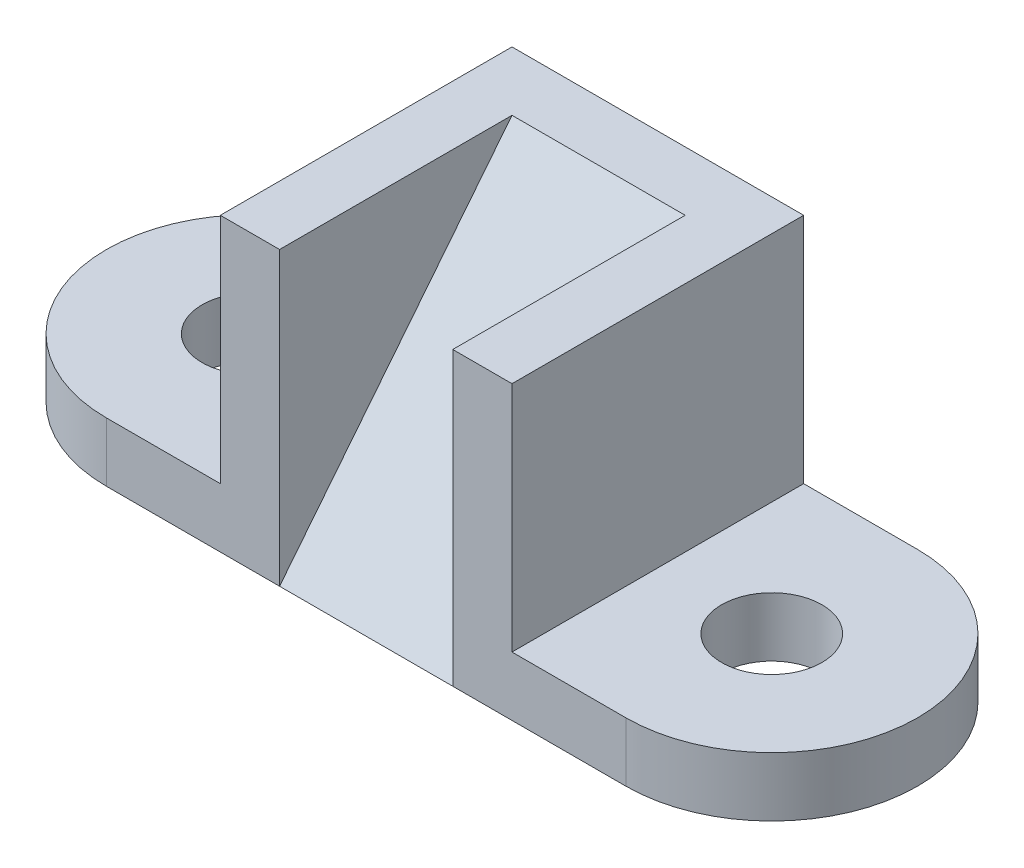
ISO-10303-21;
HEADER;
FILE_DESCRIPTION(('STEP AP214'),'2;1');
FILE_NAME('part.step','',(''),(''),'','','');
FILE_SCHEMA(('AUTOMOTIVE_DESIGN { 1 0 10303 214 1 1 1 1 }'));
ENDSEC;
DATA;
#1=APPLICATION_CONTEXT('core data for automotive mechanical design processes');
#2=APPLICATION_PROTOCOL_DEFINITION('international standard','automotive_design',2000,#1);
#3=PRODUCT_CONTEXT('',#1,'mechanical');
#4=PRODUCT('Part','Part','',(#3));
#5=PRODUCT_RELATED_PRODUCT_CATEGORY('part','',(#4));
#6=PRODUCT_DEFINITION_FORMATION('','',#4);
#7=PRODUCT_DEFINITION_CONTEXT('part definition',#1,'design');
#8=PRODUCT_DEFINITION('design','',#6,#7);
#9=PRODUCT_DEFINITION_SHAPE('','',#8);
#10=(LENGTH_UNIT() NAMED_UNIT(*) SI_UNIT(.MILLI.,.METRE.));
#11=(NAMED_UNIT(*) PLANE_ANGLE_UNIT() SI_UNIT($,.RADIAN.));
#12=(NAMED_UNIT(*) SI_UNIT($,.STERADIAN.) SOLID_ANGLE_UNIT());
#13=UNCERTAINTY_MEASURE_WITH_UNIT(LENGTH_MEASURE(1.E-05),#10,'distance_accuracy_value','');
#14=(GEOMETRIC_REPRESENTATION_CONTEXT(3) GLOBAL_UNCERTAINTY_ASSIGNED_CONTEXT((#13)) GLOBAL_UNIT_ASSIGNED_CONTEXT((#10,
#11,#12)) REPRESENTATION_CONTEXT('',''));
#15=CARTESIAN_POINT('',(0.,0.,0.));
#16=DIRECTION('',(0.,0.,1.));
#17=DIRECTION('',(1.,0.,0.));
#18=AXIS2_PLACEMENT_3D('',#15,#16,#17);
#19=CARTESIAN_POINT('',(-30.841225626741,-64.,0.));
#20=DIRECTION('',(0.,0.,1.));
#21=DIRECTION('',(1.,0.,0.));
#22=AXIS2_PLACEMENT_3D('',#19,#20,#21);
#23=PLANE('',#22);
#24=DIRECTION('',(1.,0.,0.));
#25=VECTOR('',#24,1.);
#26=CARTESIAN_POINT('',(-30.841225626741,0.,0.));
#27=LINE('',#26,#25);
#28=CARTESIAN_POINT('',(20.158774373259,0.,0.));
#29=VERTEX_POINT('',#28);
#30=CARTESIAN_POINT('',(33.158774373259,0.,0.));
#31=VERTEX_POINT('',#30);
#32=EDGE_CURVE('E210',#29,#31,#27,.T.);
#33=ORIENTED_EDGE('',*,*,#32,.F.);
#34=DIRECTION('',(0.,-1.,0.));
#35=VECTOR('',#34,1.);
#36=CARTESIAN_POINT('',(20.158774373259,138.56406460551,0.));
#37=LINE('',#36,#35);
#38=CARTESIAN_POINT('',(20.158774373259,-64.,0.));
#39=VERTEX_POINT('',#38);
#40=EDGE_CURVE('E195',#29,#39,#37,.T.);
#41=ORIENTED_EDGE('',*,*,#40,.T.);
#42=DIRECTION('',(1.,0.,0.));
#43=VECTOR('',#42,1.);
#44=CARTESIAN_POINT('',(-30.841225626741,-64.,0.));
#45=LINE('',#44,#43);
#46=CARTESIAN_POINT('',(58.158774373259,-64.,0.));
#47=VERTEX_POINT('',#46);
#48=EDGE_CURVE('E205',#39,#47,#45,.T.);
#49=ORIENTED_EDGE('',*,*,#48,.T.);
#50=DIRECTION('',(0.,-1.,0.));
#51=VECTOR('',#50,1.);
#52=CARTESIAN_POINT('',(58.158774373259,-51.,0.));
#53=LINE('',#52,#51);
#54=CARTESIAN_POINT('',(58.158774373259,-51.,0.));
#55=VERTEX_POINT('',#54);
#56=EDGE_CURVE('E132',#55,#47,#53,.T.);
#57=ORIENTED_EDGE('',*,*,#56,.F.);
#58=DIRECTION('',(1.,0.,0.));
#59=VECTOR('',#58,1.);
#60=CARTESIAN_POINT('',(0.,-51.,0.));
#61=LINE('',#60,#59);
#62=CARTESIAN_POINT('',(33.158774373259,-51.,0.));
#63=VERTEX_POINT('',#62);
#64=EDGE_CURVE('E139',#63,#55,#61,.T.);
#65=ORIENTED_EDGE('',*,*,#64,.F.);
#66=DIRECTION('',(0.,1.,0.));
#67=VECTOR('',#66,1.);
#68=CARTESIAN_POINT('',(33.158774373259,-64.,0.));
#69=LINE('',#68,#67);
#70=EDGE_CURVE('E222',#63,#31,#69,.T.);
#71=ORIENTED_EDGE('',*,*,#70,.T.);
#72=EDGE_LOOP('',(#33,#41,#49,#57,#65,#71));
#73=FACE_BOUND('',#72,.T.);
#74=ADVANCED_FACE('F39',(#73),#23,.T.);
#75=CARTESIAN_POINT('',(-30.841225626741,-64.,0.));
#76=DIRECTION('',(-1.,0.,0.));
#77=DIRECTION('',(0.,0.,1.));
#78=AXIS2_PLACEMENT_3D('',#75,#76,#77);
#79=PLANE('',#78);
#80=DIRECTION('',(0.,0.,-1.));
#81=VECTOR('',#80,1.);
#82=CARTESIAN_POINT('',(-30.841225626741,-51.,0.));
#83=LINE('',#82,#81);
#84=CARTESIAN_POINT('',(-30.841225626741,-51.,0.));
#85=VERTEX_POINT('',#84);
#86=CARTESIAN_POINT('',(-30.841225626741,-51.,-64.));
#87=VERTEX_POINT('',#86);
#88=EDGE_CURVE('E62',#85,#87,#83,.T.);
#89=ORIENTED_EDGE('',*,*,#88,.F.);
#90=DIRECTION('',(0.,1.,0.));
#91=VECTOR('',#90,1.);
#92=CARTESIAN_POINT('',(-30.841225626741,-64.,0.));
#93=LINE('',#92,#91);
#94=CARTESIAN_POINT('',(-30.841225626741,0.,0.));
#95=VERTEX_POINT('',#94);
#96=EDGE_CURVE('E207',#85,#95,#93,.T.);
#97=ORIENTED_EDGE('',*,*,#96,.T.);
#98=DIRECTION('',(0.,0.,1.));
#99=VECTOR('',#98,1.);
#100=CARTESIAN_POINT('',(-30.841225626741,0.,0.));
#101=LINE('',#100,#99);
#102=CARTESIAN_POINT('',(-30.841225626741,0.,-64.));
#103=VERTEX_POINT('',#102);
#104=EDGE_CURVE('E201',#103,#95,#101,.T.);
#105=ORIENTED_EDGE('',*,*,#104,.F.);
#106=DIRECTION('',(0.,1.,0.));
#107=VECTOR('',#106,1.);
#108=CARTESIAN_POINT('',(-30.841225626741,-64.,-64.));
#109=LINE('',#108,#107);
#110=EDGE_CURVE('E47',#87,#103,#109,.T.);
#111=ORIENTED_EDGE('',*,*,#110,.F.);
#112=EDGE_LOOP('',(#89,#97,#105,#111));
#113=FACE_BOUND('',#112,.T.);
#114=ADVANCED_FACE('F41',(#113),#79,.T.);
#115=CARTESIAN_POINT('',(-30.841225626741,-64.,-64.));
#116=DIRECTION('',(0.,0.,-1.));
#117=DIRECTION('',(-1.,0.,0.));
#118=AXIS2_PLACEMENT_3D('',#115,#116,#117);
#119=PLANE('',#118);
#120=DIRECTION('',(-1.,0.,0.));
#121=VECTOR('',#120,1.);
#122=CARTESIAN_POINT('',(-30.841225626741,0.,-64.));
#123=LINE('',#122,#121);
#124=CARTESIAN_POINT('',(33.158774373259,0.,-64.));
#125=VERTEX_POINT('',#124);
#126=EDGE_CURVE('E217',#125,#103,#123,.T.);
#127=ORIENTED_EDGE('',*,*,#126,.F.);
#128=DIRECTION('',(0.,1.,0.));
#129=VECTOR('',#128,1.);
#130=CARTESIAN_POINT('',(33.158774373259,-64.,-64.));
#131=LINE('',#130,#129);
#132=CARTESIAN_POINT('',(33.158774373259,-51.,-64.));
#133=VERTEX_POINT('',#132);
#134=EDGE_CURVE('E144',#133,#125,#131,.T.);
#135=ORIENTED_EDGE('',*,*,#134,.F.);
#136=DIRECTION('',(1.,0.,0.));
#137=VECTOR('',#136,1.);
#138=CARTESIAN_POINT('',(0.,-51.,-64.));
#139=LINE('',#138,#137);
#140=CARTESIAN_POINT('',(58.158774373259,-51.,-64.));
#141=VERTEX_POINT('',#140);
#142=EDGE_CURVE('E137',#133,#141,#139,.T.);
#143=ORIENTED_EDGE('',*,*,#142,.T.);
#144=DIRECTION('',(0.,-1.,0.));
#145=VECTOR('',#144,1.);
#146=CARTESIAN_POINT('',(58.158774373259,-51.,-64.));
#147=LINE('',#146,#145);
#148=CARTESIAN_POINT('',(58.158774373259,-64.,-64.));
#149=VERTEX_POINT('',#148);
#150=EDGE_CURVE('E123',#141,#149,#147,.T.);
#151=ORIENTED_EDGE('',*,*,#150,.T.);
#152=DIRECTION('',(-1.,0.,0.));
#153=VECTOR('',#152,1.);
#154=CARTESIAN_POINT('',(-30.841225626741,-64.,-64.));
#155=LINE('',#154,#153);
#156=CARTESIAN_POINT('',(-55.841225626741,-64.,-64.));
#157=VERTEX_POINT('',#156);
#158=EDGE_CURVE('E204',#149,#157,#155,.T.);
#159=ORIENTED_EDGE('',*,*,#158,.T.);
#160=DIRECTION('',(0.,-1.,0.));
#161=VECTOR('',#160,1.);
#162=CARTESIAN_POINT('',(-55.841225626741,-51.,-64.));
#163=LINE('',#162,#161);
#164=CARTESIAN_POINT('',(-55.841225626741,-51.,-64.));
#165=VERTEX_POINT('',#164);
#166=EDGE_CURVE('E176',#165,#157,#163,.T.);
#167=ORIENTED_EDGE('',*,*,#166,.F.);
#168=DIRECTION('',(-1.,0.,0.));
#169=VECTOR('',#168,1.);
#170=CARTESIAN_POINT('',(0.,-51.,-64.));
#171=LINE('',#170,#169);
#172=EDGE_CURVE('E168',#87,#165,#171,.T.);
#173=ORIENTED_EDGE('',*,*,#172,.F.);
#174=ORIENTED_EDGE('',*,*,#110,.T.);
#175=EDGE_LOOP('',(#127,#135,#143,#151,#159,#167,#173,#174));
#176=FACE_BOUND('',#175,.T.);
#177=ADVANCED_FACE('F143',(#176),#119,.T.);
#178=CARTESIAN_POINT('',(33.158774373259,-64.,0.));
#179=DIRECTION('',(1.,0.,0.));
#180=DIRECTION('',(0.,0.,-1.));
#181=AXIS2_PLACEMENT_3D('',#178,#179,#180);
#182=PLANE('',#181);
#183=DIRECTION('',(0.,0.,1.));
#184=VECTOR('',#183,1.);
#185=CARTESIAN_POINT('',(33.158774373259,-51.,0.));
#186=LINE('',#185,#184);
#187=EDGE_CURVE('E54',#133,#63,#186,.T.);
#188=ORIENTED_EDGE('',*,*,#187,.F.);
#189=ORIENTED_EDGE('',*,*,#134,.T.);
#190=DIRECTION('',(0.,0.,-1.));
#191=VECTOR('',#190,1.);
#192=CARTESIAN_POINT('',(33.158774373259,0.,0.));
#193=LINE('',#192,#191);
#194=EDGE_CURVE('E214',#31,#125,#193,.T.);
#195=ORIENTED_EDGE('',*,*,#194,.F.);
#196=ORIENTED_EDGE('',*,*,#70,.F.);
#197=EDGE_LOOP('',(#188,#189,#195,#196));
#198=FACE_BOUND('',#197,.T.);
#199=ADVANCED_FACE('F248',(#198),#182,.T.);
#200=DIRECTION('',(0.,-1.,0.));
#201=VECTOR('',#200,1.);
#202=CARTESIAN_POINT('',(-17.841225626741,138.56406460551,0.));
#203=LINE('',#202,#201);
#204=CARTESIAN_POINT('',(-17.841225626741,0.,0.));
#205=VERTEX_POINT('',#204);
#206=CARTESIAN_POINT('',(-17.841225626741,-64.,0.));
#207=VERTEX_POINT('',#206);
#208=EDGE_CURVE('E198',#205,#207,#203,.T.);
#209=ORIENTED_EDGE('',*,*,#208,.F.);
#210=EDGE_CURVE('E211',#95,#205,#27,.T.);
#211=ORIENTED_EDGE('',*,*,#210,.F.);
#212=ORIENTED_EDGE('',*,*,#96,.F.);
#213=DIRECTION('',(-1.,0.,0.));
#214=VECTOR('',#213,1.);
#215=CARTESIAN_POINT('',(0.,-51.,0.));
#216=LINE('',#215,#214);
#217=CARTESIAN_POINT('',(-55.841225626741,-51.,0.));
#218=VERTEX_POINT('',#217);
#219=EDGE_CURVE('E161',#85,#218,#216,.T.);
#220=ORIENTED_EDGE('',*,*,#219,.T.);
#221=DIRECTION('',(0.,-1.,0.));
#222=VECTOR('',#221,1.);
#223=CARTESIAN_POINT('',(-55.841225626741,-51.,0.));
#224=LINE('',#223,#222);
#225=CARTESIAN_POINT('',(-55.841225626741,-64.,0.));
#226=VERTEX_POINT('',#225);
#227=EDGE_CURVE('E171',#218,#226,#224,.T.);
#228=ORIENTED_EDGE('',*,*,#227,.T.);
#229=EDGE_CURVE('E202',#226,#207,#45,.T.);
#230=ORIENTED_EDGE('',*,*,#229,.T.);
#231=EDGE_LOOP('',(#209,#211,#212,#220,#228,#230));
#232=FACE_BOUND('',#231,.T.);
#233=ADVANCED_FACE('F230',(#232),#23,.T.);
#234=CARTESIAN_POINT('',(0.,-64.,0.));
#235=DIRECTION('',(0.,-1.,0.));
#236=DIRECTION('',(0.,0.,-1.));
#237=AXIS2_PLACEMENT_3D('',#234,#235,#236);
#238=PLANE('',#237);
#239=ORIENTED_EDGE('',*,*,#158,.F.);
#240=CARTESIAN_POINT('',(58.158774373259,-64.,-32.));
#241=DIRECTION('',(0.,-1.,0.));
#242=DIRECTION('',(0.,0.,-1.));
#243=AXIS2_PLACEMENT_3D('',#240,#241,#242);
#244=CIRCLE('',#243,32.);
#245=EDGE_CURVE('E129',#149,#47,#244,.T.);
#246=ORIENTED_EDGE('',*,*,#245,.T.);
#247=ORIENTED_EDGE('',*,*,#48,.F.);
#248=DIRECTION('',(1.,0.,0.));
#249=VECTOR('',#248,1.);
#250=CARTESIAN_POINT('',(-30.841225626741,-64.,0.));
#251=LINE('',#250,#249);
#252=EDGE_CURVE('E179',#207,#39,#251,.T.);
#253=ORIENTED_EDGE('',*,*,#252,.F.);
#254=ORIENTED_EDGE('',*,*,#229,.F.);
#255=CARTESIAN_POINT('',(-55.841225626741,-64.,-32.));
#256=DIRECTION('',(0.,-1.,0.));
#257=DIRECTION('',(0.,0.,-1.));
#258=AXIS2_PLACEMENT_3D('',#255,#256,#257);
#259=CIRCLE('',#258,32.);
#260=EDGE_CURVE('E162',#226,#157,#259,.T.);
#261=ORIENTED_EDGE('',*,*,#260,.T.);
#262=EDGE_LOOP('',(#239,#246,#247,#253,#254,#261));
#263=FACE_BOUND('',#262,.T.);
#264=CARTESIAN_POINT('',(-55.841225626741,-64.,-32.));
#265=DIRECTION('',(0.,-1.,0.));
#266=DIRECTION('',(0.,0.,-1.));
#267=AXIS2_PLACEMENT_3D('',#264,#265,#266);
#268=CIRCLE('',#267,11.);
#269=CARTESIAN_POINT('',(-55.841225626741,-64.,-43.));
#270=VERTEX_POINT('',#269);
#271=EDGE_CURVE('E156',#270,#270,#268,.T.);
#272=ORIENTED_EDGE('',*,*,#271,.F.);
#273=EDGE_LOOP('',(#272));
#274=FACE_BOUND('',#273,.T.);
#275=CARTESIAN_POINT('',(58.158774373259,-64.,-32.));
#276=DIRECTION('',(0.,-1.,0.));
#277=DIRECTION('',(0.,0.,-1.));
#278=AXIS2_PLACEMENT_3D('',#275,#276,#277);
#279=CIRCLE('',#278,11.);
#280=CARTESIAN_POINT('',(58.158774373259,-64.,-43.));
#281=VERTEX_POINT('',#280);
#282=EDGE_CURVE('E152',#281,#281,#279,.T.);
#283=ORIENTED_EDGE('',*,*,#282,.F.);
#284=EDGE_LOOP('',(#283));
#285=FACE_BOUND('',#284,.T.);
#286=ADVANCED_FACE('F239',(#263,#274,#285),#238,.T.);
#287=CARTESIAN_POINT('',(0.,0.,0.));
#288=DIRECTION('',(0.,-1.,0.));
#289=DIRECTION('',(0.,0.,-1.));
#290=AXIS2_PLACEMENT_3D('',#287,#288,#289);
#291=PLANE('',#290);
#292=DIRECTION('',(0.,0.,-1.));
#293=VECTOR('',#292,1.);
#294=CARTESIAN_POINT('',(-17.841225626741,0.,-51.));
#295=LINE('',#294,#293);
#296=CARTESIAN_POINT('',(-17.841225626741,0.,-51.));
#297=VERTEX_POINT('',#296);
#298=EDGE_CURVE('E187',#205,#297,#295,.T.);
#299=ORIENTED_EDGE('',*,*,#298,.T.);
#300=DIRECTION('',(1.,0.,0.));
#301=VECTOR('',#300,1.);
#302=CARTESIAN_POINT('',(20.158774373259,0.,-51.));
#303=LINE('',#302,#301);
#304=CARTESIAN_POINT('',(20.158774373259,0.,-51.));
#305=VERTEX_POINT('',#304);
#306=EDGE_CURVE('E190',#297,#305,#303,.T.);
#307=ORIENTED_EDGE('',*,*,#306,.T.);
#308=DIRECTION('',(0.,0.,1.));
#309=VECTOR('',#308,1.);
#310=CARTESIAN_POINT('',(20.158774373259,0.,0.));
#311=LINE('',#310,#309);
#312=EDGE_CURVE('E193',#305,#29,#311,.T.);
#313=ORIENTED_EDGE('',*,*,#312,.T.);
#314=ORIENTED_EDGE('',*,*,#32,.T.);
#315=ORIENTED_EDGE('',*,*,#194,.T.);
#316=ORIENTED_EDGE('',*,*,#126,.T.);
#317=ORIENTED_EDGE('',*,*,#104,.T.);
#318=ORIENTED_EDGE('',*,*,#210,.T.);
#319=EDGE_LOOP('',(#299,#307,#313,#314,#315,#316,#317,#318));
#320=FACE_BOUND('',#319,.T.);
#321=ADVANCED_FACE('F228',(#320),#291,.F.);
#322=CARTESIAN_POINT('',(-17.841225626741,138.56406460551,-51.));
#323=DIRECTION('',(1.,0.,0.));
#324=DIRECTION('',(0.,0.,-1.));
#325=AXIS2_PLACEMENT_3D('',#322,#323,#324);
#326=PLANE('',#325);
#327=DIRECTION('',(0.,-0.782059551443419,0.623203705056475));
#328=VECTOR('',#327,1.);
#329=CARTESIAN_POINT('',(-17.841225626741,84.7481571784635,-118.533687751588));
#330=LINE('',#329,#328);
#331=EDGE_CURVE('E184',#297,#207,#330,.T.);
#332=ORIENTED_EDGE('',*,*,#331,.F.);
#333=ORIENTED_EDGE('',*,*,#298,.F.);
#334=ORIENTED_EDGE('',*,*,#208,.T.);
#335=EDGE_LOOP('',(#332,#333,#334));
#336=FACE_BOUND('',#335,.T.);
#337=ADVANCED_FACE('F232',(#336),#326,.T.);
#338=CARTESIAN_POINT('',(20.158774373259,138.56406460551,0.));
#339=DIRECTION('',(-1.,0.,0.));
#340=DIRECTION('',(0.,0.,1.));
#341=AXIS2_PLACEMENT_3D('',#338,#339,#340);
#342=PLANE('',#341);
#343=DIRECTION('',(0.,0.782059551443419,-0.623203705056475));
#344=VECTOR('',#343,1.);
#345=CARTESIAN_POINT('',(20.158774373259,59.8916542667119,-98.7261619937861));
#346=LINE('',#345,#344);
#347=EDGE_CURVE('E11',#39,#305,#346,.T.);
#348=ORIENTED_EDGE('',*,*,#347,.F.);
#349=ORIENTED_EDGE('',*,*,#40,.F.);
#350=ORIENTED_EDGE('',*,*,#312,.F.);
#351=EDGE_LOOP('',(#348,#349,#350));
#352=FACE_BOUND('',#351,.T.);
#353=ADVANCED_FACE('F246',(#352),#342,.T.);
#354=CARTESIAN_POINT('',(-30.841225626741,0.,-51.));
#355=DIRECTION('',(0.,0.623203705056475,0.782059551443419));
#356=DIRECTION('',(0.,-0.782059551443419,0.623203705056475));
#357=AXIS2_PLACEMENT_3D('',#354,#355,#356);
#358=PLANE('',#357);
#359=ORIENTED_EDGE('',*,*,#306,.F.);
#360=ORIENTED_EDGE('',*,*,#331,.T.);
#361=ORIENTED_EDGE('',*,*,#252,.T.);
#362=ORIENTED_EDGE('',*,*,#347,.T.);
#363=EDGE_LOOP('',(#359,#360,#361,#362));
#364=FACE_BOUND('',#363,.T.);
#365=ADVANCED_FACE('F236',(#364),#358,.T.);
#366=CARTESIAN_POINT('',(-55.841225626741,-51.,-32.));
#367=DIRECTION('',(0.,-1.,0.));
#368=DIRECTION('',(0.,0.,-1.));
#369=AXIS2_PLACEMENT_3D('',#366,#367,#368);
#370=CYLINDRICAL_SURFACE('',#369,11.);
#371=CARTESIAN_POINT('',(-55.841225626741,-51.,-32.));
#372=DIRECTION('',(0.,-1.,0.));
#373=DIRECTION('',(0.,0.,-1.));
#374=AXIS2_PLACEMENT_3D('',#371,#372,#373);
#375=CIRCLE('',#374,11.);
#376=CARTESIAN_POINT('',(-55.841225626741,-51.,-43.));
#377=VERTEX_POINT('',#376);
#378=EDGE_CURVE('E158',#377,#377,#375,.T.);
#379=CARTESIAN_POINT('',(-55.841225626741,-51.,-43.));
#380=CARTESIAN_POINT('',(-55.841225626741,-51.1354166666667,-43.));
#381=CARTESIAN_POINT('',(-55.841225626741,-51.2708333333333,-43.));
#382=CARTESIAN_POINT('',(-55.841225626741,-51.5416666666667,-43.));
#383=CARTESIAN_POINT('',(-55.841225626741,-51.6770833333333,-43.));
#384=CARTESIAN_POINT('',(-55.841225626741,-51.9479166666667,-43.));
#385=CARTESIAN_POINT('',(-55.841225626741,-52.0833333333333,-43.));
#386=CARTESIAN_POINT('',(-55.841225626741,-52.3541666666667,-43.));
#387=CARTESIAN_POINT('',(-55.841225626741,-52.4895833333333,-43.));
#388=CARTESIAN_POINT('',(-55.841225626741,-52.7604166666667,-43.));
#389=CARTESIAN_POINT('',(-55.841225626741,-52.8958333333333,-43.));
#390=CARTESIAN_POINT('',(-55.841225626741,-53.1666666666667,-43.));
#391=CARTESIAN_POINT('',(-55.841225626741,-53.3020833333333,-43.));
#392=CARTESIAN_POINT('',(-55.841225626741,-53.5729166666667,-43.));
#393=CARTESIAN_POINT('',(-55.841225626741,-53.7083333333333,-43.));
#394=CARTESIAN_POINT('',(-55.841225626741,-53.9791666666667,-43.));
#395=CARTESIAN_POINT('',(-55.841225626741,-54.1145833333333,-43.));
#396=CARTESIAN_POINT('',(-55.841225626741,-54.3854166666667,-43.));
#397=CARTESIAN_POINT('',(-55.841225626741,-54.5208333333333,-43.));
#398=CARTESIAN_POINT('',(-55.841225626741,-54.7916666666667,-43.));
#399=CARTESIAN_POINT('',(-55.841225626741,-54.9270833333333,-43.));
#400=CARTESIAN_POINT('',(-55.841225626741,-55.1979166666667,-43.));
#401=CARTESIAN_POINT('',(-55.841225626741,-55.3333333333333,-43.));
#402=CARTESIAN_POINT('',(-55.841225626741,-55.6041666666667,-43.));
#403=CARTESIAN_POINT('',(-55.841225626741,-55.7395833333333,-43.));
#404=CARTESIAN_POINT('',(-55.841225626741,-56.0104166666667,-43.));
#405=CARTESIAN_POINT('',(-55.841225626741,-56.1458333333333,-43.));
#406=CARTESIAN_POINT('',(-55.841225626741,-56.4166666666667,-43.));
#407=CARTESIAN_POINT('',(-55.841225626741,-56.5520833333333,-43.));
#408=CARTESIAN_POINT('',(-55.841225626741,-56.8229166666667,-43.));
#409=CARTESIAN_POINT('',(-55.841225626741,-56.9583333333333,-43.));
#410=CARTESIAN_POINT('',(-55.841225626741,-57.2291666666667,-43.));
#411=CARTESIAN_POINT('',(-55.841225626741,-57.3645833333333,-43.));
#412=CARTESIAN_POINT('',(-55.841225626741,-57.6354166666667,-43.));
#413=CARTESIAN_POINT('',(-55.841225626741,-57.7708333333333,-43.));
#414=CARTESIAN_POINT('',(-55.841225626741,-58.0416666666667,-43.));
#415=CARTESIAN_POINT('',(-55.841225626741,-58.1770833333333,-43.));
#416=CARTESIAN_POINT('',(-55.841225626741,-58.4479166666667,-43.));
#417=CARTESIAN_POINT('',(-55.841225626741,-58.5833333333333,-43.));
#418=CARTESIAN_POINT('',(-55.841225626741,-58.8541666666667,-43.));
#419=CARTESIAN_POINT('',(-55.841225626741,-58.9895833333333,-43.));
#420=CARTESIAN_POINT('',(-55.841225626741,-59.2604166666667,-43.));
#421=CARTESIAN_POINT('',(-55.841225626741,-59.3958333333333,-43.));
#422=CARTESIAN_POINT('',(-55.841225626741,-59.6666666666667,-43.));
#423=CARTESIAN_POINT('',(-55.841225626741,-59.8020833333333,-43.));
#424=CARTESIAN_POINT('',(-55.841225626741,-60.0729166666667,-43.));
#425=CARTESIAN_POINT('',(-55.841225626741,-60.2083333333333,-43.));
#426=CARTESIAN_POINT('',(-55.841225626741,-60.4791666666667,-43.));
#427=CARTESIAN_POINT('',(-55.841225626741,-60.6145833333333,-43.));
#428=CARTESIAN_POINT('',(-55.841225626741,-60.8854166666667,-43.));
#429=CARTESIAN_POINT('',(-55.841225626741,-61.0208333333333,-43.));
#430=CARTESIAN_POINT('',(-55.841225626741,-61.2916666666667,-43.));
#431=CARTESIAN_POINT('',(-55.841225626741,-61.4270833333333,-43.));
#432=CARTESIAN_POINT('',(-55.841225626741,-61.6979166666667,-43.));
#433=CARTESIAN_POINT('',(-55.841225626741,-61.8333333333333,-43.));
#434=CARTESIAN_POINT('',(-55.841225626741,-62.1041666666667,-43.));
#435=CARTESIAN_POINT('',(-55.841225626741,-62.2395833333333,-43.));
#436=CARTESIAN_POINT('',(-55.841225626741,-62.5104166666667,-43.));
#437=CARTESIAN_POINT('',(-55.841225626741,-62.6458333333333,-43.));
#438=CARTESIAN_POINT('',(-55.841225626741,-62.9166666666667,-43.));
#439=CARTESIAN_POINT('',(-55.841225626741,-63.0520833333333,-43.));
#440=CARTESIAN_POINT('',(-55.841225626741,-63.3229166666667,-43.));
#441=CARTESIAN_POINT('',(-55.841225626741,-63.4583333333333,-43.));
#442=CARTESIAN_POINT('',(-55.841225626741,-63.7291666666667,-43.));
#443=CARTESIAN_POINT('',(-55.841225626741,-63.8645833333333,-43.));
#444=CARTESIAN_POINT('',(-55.841225626741,-64.,-43.));
#445=B_SPLINE_CURVE_WITH_KNOTS('',3,(#379,#380,#381,#382,#383,#384,#385,#386,#387,#388,#389,
#390,#391,#392,#393,#394,#395,#396,#397,#398,#399,#400,#401,#402,#403,#404,#405,#406,#407,#408,
#409,#410,#411,#412,#413,#414,#415,#416,#417,#418,#419,#420,#421,#422,#423,#424,#425,#426,#427,
#428,#429,#430,#431,#432,#433,#434,#435,#436,#437,#438,#439,#440,#441,#442,#443,#444),
.UNSPECIFIED.,.F.,.F.,(4,2,2,2,2,2,2,2,2,2,2,2,2,2,2,2,2,2,2,2,2,2,2,2,2,2,2,2,2,2,2,2,4),(0.,
0.406249999999997,0.812499999999994,1.21875,1.62499999999999,2.03125,2.4375,2.84374999999999,
3.25,3.65624999999999,4.0625,4.46874999999999,4.87499999999999,5.28124999999999,
5.68749999999999,6.09374999999999,6.49999999999999,6.90624999999999,7.31249999999999,
7.71874999999999,8.12499999999999,8.53124999999999,8.93749999999999,9.34374999999999,
9.74999999999999,10.15625,10.5625,10.96875,11.375,11.78125,12.1875,12.59375,13.),.UNSPECIFIED.);
#446=EDGE_CURVE('BSEAM296',#377,#270,#445,.T.);
#447=ORIENTED_EDGE('',*,*,#378,.F.);
#448=ORIENTED_EDGE('',*,*,#271,.T.);
#449=ORIENTED_EDGE('',*,*,#446,.T.);
#450=ORIENTED_EDGE('',*,*,#446,.F.);
#451=EDGE_LOOP('',(#447,#449,#448,#450));
#452=FACE_BOUND('',#451,.T.);
#453=ADVANCED_FACE('F296',(#452),#370,.F.);
#454=CARTESIAN_POINT('',(-55.841225626741,-51.,-32.));
#455=DIRECTION('',(0.,-1.,0.));
#456=DIRECTION('',(0.,0.,-1.));
#457=AXIS2_PLACEMENT_3D('',#454,#455,#456);
#458=CYLINDRICAL_SURFACE('',#457,32.);
#459=ORIENTED_EDGE('',*,*,#260,.F.);
#460=ORIENTED_EDGE('',*,*,#227,.F.);
#461=CARTESIAN_POINT('',(-55.841225626741,-51.,-32.));
#462=DIRECTION('',(0.,-1.,0.));
#463=DIRECTION('',(0.,0.,-1.));
#464=AXIS2_PLACEMENT_3D('',#461,#462,#463);
#465=CIRCLE('',#464,32.);
#466=EDGE_CURVE('E165',#218,#165,#465,.T.);
#467=ORIENTED_EDGE('',*,*,#466,.T.);
#468=ORIENTED_EDGE('',*,*,#166,.T.);
#469=EDGE_LOOP('',(#459,#460,#467,#468));
#470=FACE_BOUND('',#469,.T.);
#471=ADVANCED_FACE('F300',(#470),#458,.T.);
#472=CARTESIAN_POINT('',(0.,-51.,0.));
#473=DIRECTION('',(0.,-1.,0.));
#474=DIRECTION('',(0.,0.,-1.));
#475=AXIS2_PLACEMENT_3D('',#472,#473,#474);
#476=PLANE('',#475);
#477=ORIENTED_EDGE('',*,*,#378,.T.);
#478=EDGE_LOOP('',(#477));
#479=FACE_BOUND('',#478,.T.);
#480=ORIENTED_EDGE('',*,*,#219,.F.);
#481=ORIENTED_EDGE('',*,*,#88,.T.);
#482=ORIENTED_EDGE('',*,*,#172,.T.);
#483=ORIENTED_EDGE('',*,*,#466,.F.);
#484=EDGE_LOOP('',(#480,#481,#482,#483));
#485=FACE_BOUND('',#484,.T.);
#486=ADVANCED_FACE('F312',(#479,#485),#476,.F.);
#487=CARTESIAN_POINT('',(58.158774373259,-51.,-32.));
#488=DIRECTION('',(0.,-1.,0.));
#489=DIRECTION('',(0.,0.,-1.));
#490=AXIS2_PLACEMENT_3D('',#487,#488,#489);
#491=CYLINDRICAL_SURFACE('',#490,11.);
#492=CARTESIAN_POINT('',(58.158774373259,-51.,-32.));
#493=DIRECTION('',(0.,-1.,0.));
#494=DIRECTION('',(0.,0.,-1.));
#495=AXIS2_PLACEMENT_3D('',#492,#493,#494);
#496=CIRCLE('',#495,11.);
#497=CARTESIAN_POINT('',(58.158774373259,-51.,-43.));
#498=VERTEX_POINT('',#497);
#499=EDGE_CURVE('E145',#498,#498,#496,.T.);
#500=CARTESIAN_POINT('',(58.158774373259,-51.,-43.));
#501=CARTESIAN_POINT('',(58.158774373259,-51.1354166666667,-43.));
#502=CARTESIAN_POINT('',(58.158774373259,-51.2708333333333,-43.));
#503=CARTESIAN_POINT('',(58.158774373259,-51.5416666666667,-43.));
#504=CARTESIAN_POINT('',(58.158774373259,-51.6770833333333,-43.));
#505=CARTESIAN_POINT('',(58.158774373259,-51.9479166666667,-43.));
#506=CARTESIAN_POINT('',(58.158774373259,-52.0833333333333,-43.));
#507=CARTESIAN_POINT('',(58.158774373259,-52.3541666666667,-43.));
#508=CARTESIAN_POINT('',(58.158774373259,-52.4895833333333,-43.));
#509=CARTESIAN_POINT('',(58.158774373259,-52.7604166666667,-43.));
#510=CARTESIAN_POINT('',(58.158774373259,-52.8958333333333,-43.));
#511=CARTESIAN_POINT('',(58.158774373259,-53.1666666666667,-43.));
#512=CARTESIAN_POINT('',(58.158774373259,-53.3020833333333,-43.));
#513=CARTESIAN_POINT('',(58.158774373259,-53.5729166666667,-43.));
#514=CARTESIAN_POINT('',(58.158774373259,-53.7083333333333,-43.));
#515=CARTESIAN_POINT('',(58.158774373259,-53.9791666666667,-43.));
#516=CARTESIAN_POINT('',(58.158774373259,-54.1145833333333,-43.));
#517=CARTESIAN_POINT('',(58.158774373259,-54.3854166666667,-43.));
#518=CARTESIAN_POINT('',(58.158774373259,-54.5208333333333,-43.));
#519=CARTESIAN_POINT('',(58.158774373259,-54.7916666666667,-43.));
#520=CARTESIAN_POINT('',(58.158774373259,-54.9270833333333,-43.));
#521=CARTESIAN_POINT('',(58.158774373259,-55.1979166666667,-43.));
#522=CARTESIAN_POINT('',(58.158774373259,-55.3333333333333,-43.));
#523=CARTESIAN_POINT('',(58.158774373259,-55.6041666666667,-43.));
#524=CARTESIAN_POINT('',(58.158774373259,-55.7395833333333,-43.));
#525=CARTESIAN_POINT('',(58.158774373259,-56.0104166666667,-43.));
#526=CARTESIAN_POINT('',(58.158774373259,-56.1458333333333,-43.));
#527=CARTESIAN_POINT('',(58.158774373259,-56.4166666666667,-43.));
#528=CARTESIAN_POINT('',(58.158774373259,-56.5520833333333,-43.));
#529=CARTESIAN_POINT('',(58.158774373259,-56.8229166666667,-43.));
#530=CARTESIAN_POINT('',(58.158774373259,-56.9583333333333,-43.));
#531=CARTESIAN_POINT('',(58.158774373259,-57.2291666666667,-43.));
#532=CARTESIAN_POINT('',(58.158774373259,-57.3645833333333,-43.));
#533=CARTESIAN_POINT('',(58.158774373259,-57.6354166666667,-43.));
#534=CARTESIAN_POINT('',(58.158774373259,-57.7708333333333,-43.));
#535=CARTESIAN_POINT('',(58.158774373259,-58.0416666666667,-43.));
#536=CARTESIAN_POINT('',(58.158774373259,-58.1770833333333,-43.));
#537=CARTESIAN_POINT('',(58.158774373259,-58.4479166666667,-43.));
#538=CARTESIAN_POINT('',(58.158774373259,-58.5833333333333,-43.));
#539=CARTESIAN_POINT('',(58.158774373259,-58.8541666666667,-43.));
#540=CARTESIAN_POINT('',(58.158774373259,-58.9895833333333,-43.));
#541=CARTESIAN_POINT('',(58.158774373259,-59.2604166666667,-43.));
#542=CARTESIAN_POINT('',(58.158774373259,-59.3958333333333,-43.));
#543=CARTESIAN_POINT('',(58.158774373259,-59.6666666666667,-43.));
#544=CARTESIAN_POINT('',(58.158774373259,-59.8020833333333,-43.));
#545=CARTESIAN_POINT('',(58.158774373259,-60.0729166666667,-43.));
#546=CARTESIAN_POINT('',(58.158774373259,-60.2083333333333,-43.));
#547=CARTESIAN_POINT('',(58.158774373259,-60.4791666666667,-43.));
#548=CARTESIAN_POINT('',(58.158774373259,-60.6145833333333,-43.));
#549=CARTESIAN_POINT('',(58.158774373259,-60.8854166666667,-43.));
#550=CARTESIAN_POINT('',(58.158774373259,-61.0208333333333,-43.));
#551=CARTESIAN_POINT('',(58.158774373259,-61.2916666666667,-43.));
#552=CARTESIAN_POINT('',(58.158774373259,-61.4270833333333,-43.));
#553=CARTESIAN_POINT('',(58.158774373259,-61.6979166666667,-43.));
#554=CARTESIAN_POINT('',(58.158774373259,-61.8333333333333,-43.));
#555=CARTESIAN_POINT('',(58.158774373259,-62.1041666666667,-43.));
#556=CARTESIAN_POINT('',(58.158774373259,-62.2395833333333,-43.));
#557=CARTESIAN_POINT('',(58.158774373259,-62.5104166666667,-43.));
#558=CARTESIAN_POINT('',(58.158774373259,-62.6458333333333,-43.));
#559=CARTESIAN_POINT('',(58.158774373259,-62.9166666666667,-43.));
#560=CARTESIAN_POINT('',(58.158774373259,-63.0520833333333,-43.));
#561=CARTESIAN_POINT('',(58.158774373259,-63.3229166666667,-43.));
#562=CARTESIAN_POINT('',(58.158774373259,-63.4583333333333,-43.));
#563=CARTESIAN_POINT('',(58.158774373259,-63.7291666666667,-43.));
#564=CARTESIAN_POINT('',(58.158774373259,-63.8645833333333,-43.));
#565=CARTESIAN_POINT('',(58.158774373259,-64.,-43.));
#566=B_SPLINE_CURVE_WITH_KNOTS('',3,(#500,#501,#502,#503,#504,#505,#506,#507,#508,#509,#510,
#511,#512,#513,#514,#515,#516,#517,#518,#519,#520,#521,#522,#523,#524,#525,#526,#527,#528,#529,
#530,#531,#532,#533,#534,#535,#536,#537,#538,#539,#540,#541,#542,#543,#544,#545,#546,#547,#548,
#549,#550,#551,#552,#553,#554,#555,#556,#557,#558,#559,#560,#561,#562,#563,#564,#565),
.UNSPECIFIED.,.F.,.F.,(4,2,2,2,2,2,2,2,2,2,2,2,2,2,2,2,2,2,2,2,2,2,2,2,2,2,2,2,2,2,2,2,4),(0.,
0.406249999999997,0.812499999999994,1.21875,1.62499999999999,2.03125,2.4375,2.84374999999999,
3.25,3.65624999999999,4.0625,4.46874999999999,4.87499999999999,5.28124999999999,
5.68749999999999,6.09374999999999,6.49999999999999,6.90624999999999,7.31249999999999,
7.71874999999999,8.12499999999999,8.53124999999999,8.93749999999999,9.34374999999999,
9.74999999999999,10.15625,10.5625,10.96875,11.375,11.78125,12.1875,12.59375,13.),.UNSPECIFIED.);
#567=EDGE_CURVE('BSEAM323',#498,#281,#566,.T.);
#568=ORIENTED_EDGE('',*,*,#499,.F.);
#569=ORIENTED_EDGE('',*,*,#282,.T.);
#570=ORIENTED_EDGE('',*,*,#567,.T.);
#571=ORIENTED_EDGE('',*,*,#567,.F.);
#572=EDGE_LOOP('',(#568,#570,#569,#571));
#573=FACE_BOUND('',#572,.T.);
#574=ADVANCED_FACE('F323',(#573),#491,.F.);
#575=CARTESIAN_POINT('',(58.158774373259,-51.,-32.));
#576=DIRECTION('',(0.,-1.,0.));
#577=DIRECTION('',(0.,0.,-1.));
#578=AXIS2_PLACEMENT_3D('',#575,#576,#577);
#579=CYLINDRICAL_SURFACE('',#578,32.);
#580=ORIENTED_EDGE('',*,*,#245,.F.);
#581=ORIENTED_EDGE('',*,*,#150,.F.);
#582=CARTESIAN_POINT('',(58.158774373259,-51.,-32.));
#583=DIRECTION('',(0.,-1.,0.));
#584=DIRECTION('',(0.,0.,-1.));
#585=AXIS2_PLACEMENT_3D('',#582,#583,#584);
#586=CIRCLE('',#585,32.);
#587=EDGE_CURVE('E127',#141,#55,#586,.T.);
#588=ORIENTED_EDGE('',*,*,#587,.T.);
#589=ORIENTED_EDGE('',*,*,#56,.T.);
#590=EDGE_LOOP('',(#580,#581,#588,#589));
#591=FACE_BOUND('',#590,.T.);
#592=ADVANCED_FACE('F125',(#591),#579,.T.);
#593=CARTESIAN_POINT('',(0.,-51.,0.));
#594=DIRECTION('',(0.,-1.,0.));
#595=DIRECTION('',(0.,0.,-1.));
#596=AXIS2_PLACEMENT_3D('',#593,#594,#595);
#597=PLANE('',#596);
#598=ORIENTED_EDGE('',*,*,#499,.T.);
#599=EDGE_LOOP('',(#598));
#600=FACE_BOUND('',#599,.T.);
#601=ORIENTED_EDGE('',*,*,#142,.F.);
#602=ORIENTED_EDGE('',*,*,#187,.T.);
#603=ORIENTED_EDGE('',*,*,#64,.T.);
#604=ORIENTED_EDGE('',*,*,#587,.F.);
#605=EDGE_LOOP('',(#601,#602,#603,#604));
#606=FACE_BOUND('',#605,.T.);
#607=ADVANCED_FACE('F136',(#600,#606),#597,.F.);
#608=CLOSED_SHELL('',(#74,#114,#177,#199,#233,#286,#321,#337,#353,#365,#453,#471,#486,#574,#592,#607));
#609=MANIFOLD_SOLID_BREP('B2',#608);
#610=ADVANCED_BREP_SHAPE_REPRESENTATION('',(#18,#609),#14);
#611=SHAPE_DEFINITION_REPRESENTATION(#9,#610);
ENDSEC;
END-ISO-10303-21;
